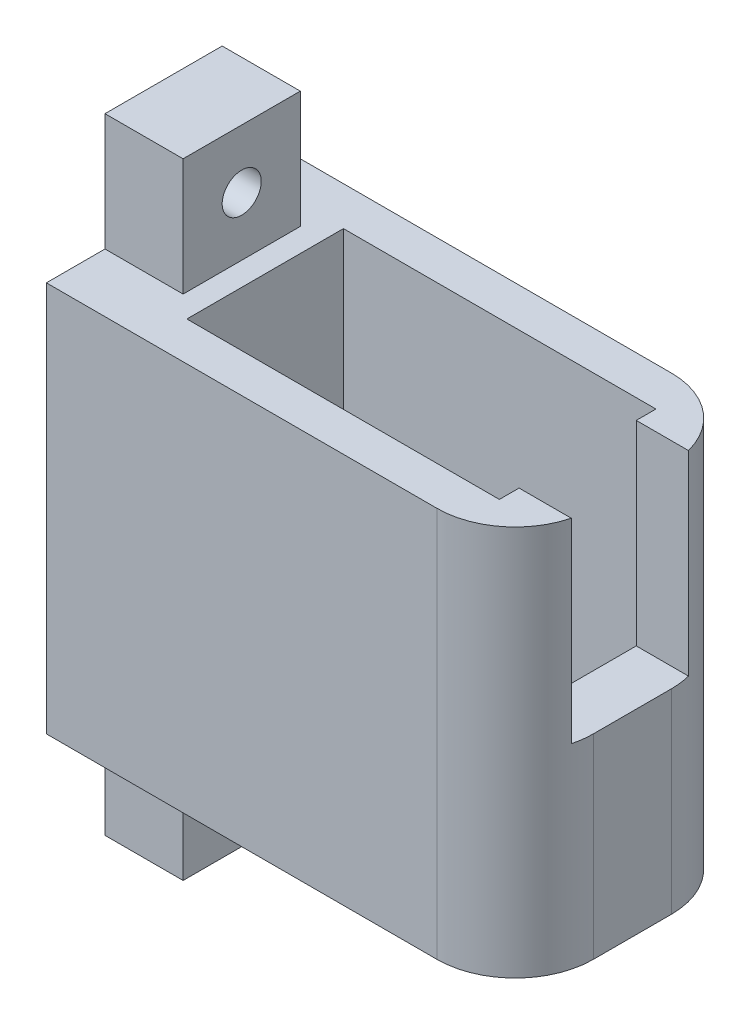
ISO-10303-21;
HEADER;
FILE_DESCRIPTION(('STEP AP214'),'2;1');
FILE_NAME('part.step','',(''),(''),'','','');
FILE_SCHEMA(('AUTOMOTIVE_DESIGN { 1 0 10303 214 1 1 1 1 }'));
ENDSEC;
DATA;
#1=APPLICATION_CONTEXT('core data for automotive mechanical design processes');
#2=APPLICATION_PROTOCOL_DEFINITION('international standard','automotive_design',2000,#1);
#3=PRODUCT_CONTEXT('',#1,'mechanical');
#4=PRODUCT('Part','Part','',(#3));
#5=PRODUCT_RELATED_PRODUCT_CATEGORY('part','',(#4));
#6=PRODUCT_DEFINITION_FORMATION('','',#4);
#7=PRODUCT_DEFINITION_CONTEXT('part definition',#1,'design');
#8=PRODUCT_DEFINITION('design','',#6,#7);
#9=PRODUCT_DEFINITION_SHAPE('','',#8);
#10=(LENGTH_UNIT() NAMED_UNIT(*) SI_UNIT(.MILLI.,.METRE.));
#11=(NAMED_UNIT(*) PLANE_ANGLE_UNIT() SI_UNIT($,.RADIAN.));
#12=(NAMED_UNIT(*) SI_UNIT($,.STERADIAN.) SOLID_ANGLE_UNIT());
#13=UNCERTAINTY_MEASURE_WITH_UNIT(LENGTH_MEASURE(1.E-05),#10,'distance_accuracy_value','');
#14=(GEOMETRIC_REPRESENTATION_CONTEXT(3) GLOBAL_UNCERTAINTY_ASSIGNED_CONTEXT((#13)) GLOBAL_UNIT_ASSIGNED_CONTEXT((#10,
#11,#12)) REPRESENTATION_CONTEXT('',''));
#15=CARTESIAN_POINT('',(0.,0.,0.));
#16=DIRECTION('',(0.,0.,1.));
#17=DIRECTION('',(1.,0.,0.));
#18=AXIS2_PLACEMENT_3D('',#15,#16,#17);
#19=CARTESIAN_POINT('',(3.,-20.,10.02));
#20=DIRECTION('',(0.,-1.,0.));
#21=DIRECTION('',(0.,0.,-1.));
#22=AXIS2_PLACEMENT_3D('',#19,#20,#21);
#23=PLANE('',#22);
#24=CARTESIAN_POINT('',(32.98,-20.,0.));
#25=DIRECTION('',(0.,1.,0.));
#26=DIRECTION('',(0.,0.,1.));
#27=AXIS2_PLACEMENT_3D('',#24,#25,#26);
#28=CIRCLE('',#27,10.02);
#29=CARTESIAN_POINT('',(32.98,-20.,10.02));
#30=VERTEX_POINT('',#29);
#31=CARTESIAN_POINT('',(43.,-20.,0.));
#32=VERTEX_POINT('',#31);
#33=EDGE_CURVE('E238',#30,#32,#28,.T.);
#34=ORIENTED_EDGE('',*,*,#33,.F.);
#35=DIRECTION('',(1.,0.,0.));
#36=VECTOR('',#35,1.);
#37=CARTESIAN_POINT('',(3.,-20.,10.02));
#38=LINE('',#37,#36);
#39=CARTESIAN_POINT('',(43.,-20.,10.02));
#40=VERTEX_POINT('',#39);
#41=EDGE_CURVE('E350',#30,#40,#38,.T.);
#42=ORIENTED_EDGE('',*,*,#41,.T.);
#43=DIRECTION('',(0.,0.,-1.));
#44=VECTOR('',#43,1.);
#45=CARTESIAN_POINT('',(43.,-20.,10.02));
#46=LINE('',#45,#44);
#47=EDGE_CURVE('E354',#40,#32,#46,.T.);
#48=ORIENTED_EDGE('',*,*,#47,.T.);
#49=EDGE_LOOP('',(#34,#42,#48));
#50=FACE_BOUND('',#49,.T.);
#51=ADVANCED_FACE('F39',(#50),#23,.F.);
#52=CARTESIAN_POINT('',(32.98,-20.,-10.02));
#53=VERTEX_POINT('',#52);
#54=EDGE_CURVE('E326',#32,#53,#28,.T.);
#55=ORIENTED_EDGE('',*,*,#54,.F.);
#56=CARTESIAN_POINT('',(43.,-20.,-10.02));
#57=VERTEX_POINT('',#56);
#58=EDGE_CURVE('E353',#32,#57,#46,.T.);
#59=ORIENTED_EDGE('',*,*,#58,.T.);
#60=DIRECTION('',(1.,0.,0.));
#61=VECTOR('',#60,1.);
#62=CARTESIAN_POINT('',(3.,-20.,-10.02));
#63=LINE('',#62,#61);
#64=EDGE_CURVE('E370',#53,#57,#63,.T.);
#65=ORIENTED_EDGE('',*,*,#64,.F.);
#66=EDGE_LOOP('',(#55,#59,#65));
#67=FACE_BOUND('',#66,.T.);
#68=ADVANCED_FACE('F422',(#67),#23,.F.);
#69=CARTESIAN_POINT('',(50.,25.,15.));
#70=DIRECTION('',(0.,-1.,0.));
#71=DIRECTION('',(0.,0.,-1.));
#72=AXIS2_PLACEMENT_3D('',#69,#70,#71);
#73=PLANE('',#72);
#74=DIRECTION('',(1.,0.,0.));
#75=VECTOR('',#74,1.);
#76=CARTESIAN_POINT('',(10.,25.,-7.5));
#77=LINE('',#76,#75);
#78=CARTESIAN_POINT('',(43.,25.,-7.5));
#79=VERTEX_POINT('',#78);
#80=CARTESIAN_POINT('',(49.6824583655185,25.,-7.5));
#81=VERTEX_POINT('',#80);
#82=EDGE_CURVE('E335',#79,#81,#77,.T.);
#83=ORIENTED_EDGE('',*,*,#82,.T.);
#84=CARTESIAN_POINT('',(40.,25.,-5.));
#85=DIRECTION('',(0.,-1.,0.));
#86=DIRECTION('',(0.,0.,-1.));
#87=AXIS2_PLACEMENT_3D('',#84,#85,#86);
#88=CIRCLE('',#87,10.);
#89=CARTESIAN_POINT('',(40.,25.,-15.));
#90=VERTEX_POINT('',#89);
#91=EDGE_CURVE('E260',#81,#90,#88,.F.);
#92=ORIENTED_EDGE('',*,*,#91,.T.);
#93=DIRECTION('',(-1.,0.,0.));
#94=VECTOR('',#93,1.);
#95=CARTESIAN_POINT('',(50.,25.,-15.));
#96=LINE('',#95,#94);
#97=CARTESIAN_POINT('',(-10.,25.,-15.));
#98=VERTEX_POINT('',#97);
#99=EDGE_CURVE('E299',#90,#98,#96,.T.);
#100=ORIENTED_EDGE('',*,*,#99,.T.);
#101=DIRECTION('',(0.,0.,-1.));
#102=VECTOR('',#101,1.);
#103=CARTESIAN_POINT('',(-10.,25.,15.));
#104=LINE('',#103,#102);
#105=CARTESIAN_POINT('',(-10.,25.,-7.5));
#106=VERTEX_POINT('',#105);
#107=EDGE_CURVE('E382',#106,#98,#104,.T.);
#108=ORIENTED_EDGE('',*,*,#107,.F.);
#109=DIRECTION('',(1.,0.,0.));
#110=VECTOR('',#109,1.);
#111=CARTESIAN_POINT('',(-40.,25.,-7.5));
#112=LINE('',#111,#110);
#113=CARTESIAN_POINT('',(0.,25.,-7.5));
#114=VERTEX_POINT('',#113);
#115=EDGE_CURVE('E706',#106,#114,#112,.T.);
#116=ORIENTED_EDGE('',*,*,#115,.T.);
#117=DIRECTION('',(0.,0.,-1.));
#118=VECTOR('',#117,1.);
#119=CARTESIAN_POINT('',(0.,25.,15.));
#120=LINE('',#119,#118);
#121=CARTESIAN_POINT('',(0.,25.,7.5));
#122=VERTEX_POINT('',#121);
#123=EDGE_CURVE('E287',#122,#114,#120,.T.);
#124=ORIENTED_EDGE('',*,*,#123,.F.);
#125=DIRECTION('',(1.,0.,0.));
#126=VECTOR('',#125,1.);
#127=CARTESIAN_POINT('',(-40.,25.,7.5));
#128=LINE('',#127,#126);
#129=CARTESIAN_POINT('',(-10.,25.,7.5));
#130=VERTEX_POINT('',#129);
#131=EDGE_CURVE('E696',#130,#122,#128,.T.);
#132=ORIENTED_EDGE('',*,*,#131,.F.);
#133=DIRECTION('',(0.,0.,-1.));
#134=VECTOR('',#133,1.);
#135=CARTESIAN_POINT('',(-10.,25.,15.));
#136=LINE('',#135,#134);
#137=CARTESIAN_POINT('',(-10.,25.,15.));
#138=VERTEX_POINT('',#137);
#139=EDGE_CURVE('E282',#138,#130,#136,.T.);
#140=ORIENTED_EDGE('',*,*,#139,.F.);
#141=DIRECTION('',(-1.,0.,0.));
#142=VECTOR('',#141,1.);
#143=CARTESIAN_POINT('',(50.,25.,15.));
#144=LINE('',#143,#142);
#145=CARTESIAN_POINT('',(40.,25.,15.));
#146=VERTEX_POINT('',#145);
#147=EDGE_CURVE('E271',#146,#138,#144,.T.);
#148=ORIENTED_EDGE('',*,*,#147,.F.);
#149=CARTESIAN_POINT('',(40.,25.,5.));
#150=DIRECTION('',(0.,-1.,0.));
#151=DIRECTION('',(0.,0.,-1.));
#152=AXIS2_PLACEMENT_3D('',#149,#150,#151);
#153=CIRCLE('',#152,10.);
#154=CARTESIAN_POINT('',(49.6824583655185,25.,7.5));
#155=VERTEX_POINT('',#154);
#156=EDGE_CURVE('E258',#146,#155,#153,.F.);
#157=ORIENTED_EDGE('',*,*,#156,.T.);
#158=DIRECTION('',(1.,0.,0.));
#159=VECTOR('',#158,1.);
#160=CARTESIAN_POINT('',(10.,25.,7.5));
#161=LINE('',#160,#159);
#162=CARTESIAN_POINT('',(43.,25.,7.5));
#163=VERTEX_POINT('',#162);
#164=EDGE_CURVE('E329',#163,#155,#161,.T.);
#165=ORIENTED_EDGE('',*,*,#164,.F.);
#166=DIRECTION('',(0.,0.,1.));
#167=VECTOR('',#166,1.);
#168=CARTESIAN_POINT('',(43.,25.,10.02));
#169=LINE('',#168,#167);
#170=CARTESIAN_POINT('',(43.,25.,10.02));
#171=VERTEX_POINT('',#170);
#172=EDGE_CURVE('E359',#163,#171,#169,.T.);
#173=ORIENTED_EDGE('',*,*,#172,.T.);
#174=DIRECTION('',(1.,0.,0.));
#175=VECTOR('',#174,1.);
#176=CARTESIAN_POINT('',(3.,25.,10.02));
#177=LINE('',#176,#175);
#178=CARTESIAN_POINT('',(3.,25.,10.02));
#179=VERTEX_POINT('',#178);
#180=EDGE_CURVE('E297',#179,#171,#177,.T.);
#181=ORIENTED_EDGE('',*,*,#180,.F.);
#182=DIRECTION('',(0.,0.,1.));
#183=VECTOR('',#182,1.);
#184=CARTESIAN_POINT('',(3.,25.,10.02));
#185=LINE('',#184,#183);
#186=CARTESIAN_POINT('',(3.,25.,-10.02));
#187=VERTEX_POINT('',#186);
#188=EDGE_CURVE('E347',#187,#179,#185,.T.);
#189=ORIENTED_EDGE('',*,*,#188,.F.);
#190=DIRECTION('',(1.,0.,0.));
#191=VECTOR('',#190,1.);
#192=CARTESIAN_POINT('',(3.,25.,-10.02));
#193=LINE('',#192,#191);
#194=CARTESIAN_POINT('',(43.,25.,-10.02));
#195=VERTEX_POINT('',#194);
#196=EDGE_CURVE('E364',#187,#195,#193,.T.);
#197=ORIENTED_EDGE('',*,*,#196,.T.);
#198=EDGE_CURVE('E341',#195,#79,#169,.T.);
#199=ORIENTED_EDGE('',*,*,#198,.T.);
#200=EDGE_LOOP('',(#83,#92,#100,#108,#116,#124,#132,#140,#148,#157,#165,#173,#181,#189,#197,#199));
#201=FACE_BOUND('',#200,.T.);
#202=ADVANCED_FACE('F277',(#201),#73,.F.);
#203=CARTESIAN_POINT('',(0.,40.,15.));
#204=DIRECTION('',(0.,-1.,0.));
#205=DIRECTION('',(1.,0.,0.));
#206=AXIS2_PLACEMENT_3D('',#203,#204,#205);
#207=PLANE('',#206);
#208=DIRECTION('',(0.,0.,-1.));
#209=VECTOR('',#208,1.);
#210=CARTESIAN_POINT('',(0.,40.,15.));
#211=LINE('',#210,#209);
#212=CARTESIAN_POINT('',(0.,40.,7.5));
#213=VERTEX_POINT('',#212);
#214=CARTESIAN_POINT('',(0.,40.,-7.5));
#215=VERTEX_POINT('',#214);
#216=EDGE_CURVE('E284',#213,#215,#211,.T.);
#217=ORIENTED_EDGE('',*,*,#216,.T.);
#218=DIRECTION('',(1.,0.,0.));
#219=VECTOR('',#218,1.);
#220=CARTESIAN_POINT('',(-40.,40.,-7.5));
#221=LINE('',#220,#219);
#222=CARTESIAN_POINT('',(-10.,40.,-7.5));
#223=VERTEX_POINT('',#222);
#224=EDGE_CURVE('E710',#223,#215,#221,.T.);
#225=ORIENTED_EDGE('',*,*,#224,.F.);
#226=DIRECTION('',(0.,0.,-1.));
#227=VECTOR('',#226,1.);
#228=CARTESIAN_POINT('',(-10.,40.,15.));
#229=LINE('',#228,#227);
#230=CARTESIAN_POINT('',(-10.,40.,7.5));
#231=VERTEX_POINT('',#230);
#232=EDGE_CURVE('E225',#231,#223,#229,.T.);
#233=ORIENTED_EDGE('',*,*,#232,.F.);
#234=DIRECTION('',(1.,0.,0.));
#235=VECTOR('',#234,1.);
#236=CARTESIAN_POINT('',(-40.,40.,7.5));
#237=LINE('',#236,#235);
#238=EDGE_CURVE('E701',#231,#213,#237,.T.);
#239=ORIENTED_EDGE('',*,*,#238,.T.);
#240=EDGE_LOOP('',(#217,#225,#233,#239));
#241=FACE_BOUND('',#240,.T.);
#242=ADVANCED_FACE('F542',(#241),#207,.F.);
#243=CARTESIAN_POINT('',(-10.,40.,15.));
#244=DIRECTION('',(1.,0.,0.));
#245=DIRECTION('',(0.,0.,-1.));
#246=AXIS2_PLACEMENT_3D('',#243,#244,#245);
#247=PLANE('',#246);
#248=CARTESIAN_POINT('',(-10.,-32.5,0.));
#249=DIRECTION('',(1.,0.,0.));
#250=DIRECTION('',(0.,0.,-1.));
#251=AXIS2_PLACEMENT_3D('',#248,#249,#250);
#252=CIRCLE('',#251,2.5);
#253=CARTESIAN_POINT('',(-10.,-32.5,-2.5));
#254=VERTEX_POINT('',#253);
#255=EDGE_CURVE('E399',#254,#254,#252,.T.);
#256=ORIENTED_EDGE('',*,*,#255,.T.);
#257=EDGE_LOOP('',(#256));
#258=FACE_BOUND('',#257,.T.);
#259=CARTESIAN_POINT('',(-10.,32.5,0.));
#260=DIRECTION('',(1.,0.,0.));
#261=DIRECTION('',(0.,0.,-1.));
#262=AXIS2_PLACEMENT_3D('',#259,#260,#261);
#263=CIRCLE('',#262,2.5);
#264=CARTESIAN_POINT('',(-10.,32.5,-2.5));
#265=VERTEX_POINT('',#264);
#266=EDGE_CURVE('E384',#265,#265,#263,.T.);
#267=ORIENTED_EDGE('',*,*,#266,.T.);
#268=EDGE_LOOP('',(#267));
#269=FACE_BOUND('',#268,.T.);
#270=DIRECTION('',(0.,-1.,0.));
#271=VECTOR('',#270,1.);
#272=CARTESIAN_POINT('',(-10.,40.,-7.5));
#273=LINE('',#272,#271);
#274=EDGE_CURVE('E395',#223,#106,#273,.T.);
#275=ORIENTED_EDGE('',*,*,#274,.T.);
#276=ORIENTED_EDGE('',*,*,#107,.T.);
#277=DIRECTION('',(0.,-1.,0.));
#278=VECTOR('',#277,1.);
#279=CARTESIAN_POINT('',(-10.,40.,-15.));
#280=LINE('',#279,#278);
#281=CARTESIAN_POINT('',(-10.,-25.,-15.));
#282=VERTEX_POINT('',#281);
#283=EDGE_CURVE('E293',#98,#282,#280,.T.);
#284=ORIENTED_EDGE('',*,*,#283,.T.);
#285=DIRECTION('',(0.,0.,1.));
#286=VECTOR('',#285,1.);
#287=CARTESIAN_POINT('',(-10.,-25.,15.));
#288=LINE('',#287,#286);
#289=CARTESIAN_POINT('',(-10.,-25.,-7.5));
#290=VERTEX_POINT('',#289);
#291=EDGE_CURVE('E387',#282,#290,#288,.T.);
#292=ORIENTED_EDGE('',*,*,#291,.T.);
#293=DIRECTION('',(0.,-1.,0.));
#294=VECTOR('',#293,1.);
#295=CARTESIAN_POINT('',(-10.,40.,-7.5));
#296=LINE('',#295,#294);
#297=CARTESIAN_POINT('',(-10.,-40.,-7.5));
#298=VERTEX_POINT('',#297);
#299=EDGE_CURVE('E397',#290,#298,#296,.T.);
#300=ORIENTED_EDGE('',*,*,#299,.T.);
#301=DIRECTION('',(0.,0.,-1.));
#302=VECTOR('',#301,1.);
#303=CARTESIAN_POINT('',(-10.,-40.,15.));
#304=LINE('',#303,#302);
#305=CARTESIAN_POINT('',(-10.,-40.,7.5));
#306=VERTEX_POINT('',#305);
#307=EDGE_CURVE('E217',#306,#298,#304,.T.);
#308=ORIENTED_EDGE('',*,*,#307,.F.);
#309=DIRECTION('',(0.,1.,0.));
#310=VECTOR('',#309,1.);
#311=CARTESIAN_POINT('',(-10.,40.,7.5));
#312=LINE('',#311,#310);
#313=CARTESIAN_POINT('',(-10.,-25.,7.5));
#314=VERTEX_POINT('',#313);
#315=EDGE_CURVE('E380',#306,#314,#312,.T.);
#316=ORIENTED_EDGE('',*,*,#315,.T.);
#317=DIRECTION('',(0.,0.,1.));
#318=VECTOR('',#317,1.);
#319=CARTESIAN_POINT('',(-10.,-25.,15.));
#320=LINE('',#319,#318);
#321=CARTESIAN_POINT('',(-10.,-25.,15.));
#322=VERTEX_POINT('',#321);
#323=EDGE_CURVE('E379',#314,#322,#320,.T.);
#324=ORIENTED_EDGE('',*,*,#323,.T.);
#325=DIRECTION('',(0.,-1.,0.));
#326=VECTOR('',#325,1.);
#327=CARTESIAN_POINT('',(-10.,40.,15.));
#328=LINE('',#327,#326);
#329=EDGE_CURVE('E289',#138,#322,#328,.T.);
#330=ORIENTED_EDGE('',*,*,#329,.F.);
#331=ORIENTED_EDGE('',*,*,#139,.T.);
#332=DIRECTION('',(0.,1.,0.));
#333=VECTOR('',#332,1.);
#334=CARTESIAN_POINT('',(-10.,40.,7.5));
#335=LINE('',#334,#333);
#336=EDGE_CURVE('E393',#130,#231,#335,.T.);
#337=ORIENTED_EDGE('',*,*,#336,.T.);
#338=ORIENTED_EDGE('',*,*,#232,.T.);
#339=EDGE_LOOP('',(#275,#276,#284,#292,#300,#308,#316,#324,#330,#331,#337,#338));
#340=FACE_BOUND('',#339,.T.);
#341=ADVANCED_FACE('F376',(#258,#269,#340),#247,.F.);
#342=CARTESIAN_POINT('',(-10.,-40.,15.));
#343=DIRECTION('',(0.,1.,0.));
#344=DIRECTION('',(-1.,0.,0.));
#345=AXIS2_PLACEMENT_3D('',#342,#343,#344);
#346=PLANE('',#345);
#347=DIRECTION('',(0.,0.,-1.));
#348=VECTOR('',#347,1.);
#349=CARTESIAN_POINT('',(0.,-40.,15.));
#350=LINE('',#349,#348);
#351=CARTESIAN_POINT('',(0.,-40.,7.5));
#352=VERTEX_POINT('',#351);
#353=CARTESIAN_POINT('',(0.,-40.,-7.5));
#354=VERTEX_POINT('',#353);
#355=EDGE_CURVE('E215',#352,#354,#350,.T.);
#356=ORIENTED_EDGE('',*,*,#355,.F.);
#357=DIRECTION('',(1.,0.,0.));
#358=VECTOR('',#357,1.);
#359=CARTESIAN_POINT('',(-40.,-40.,7.5));
#360=LINE('',#359,#358);
#361=EDGE_CURVE('E721',#306,#352,#360,.T.);
#362=ORIENTED_EDGE('',*,*,#361,.F.);
#363=ORIENTED_EDGE('',*,*,#307,.T.);
#364=DIRECTION('',(1.,0.,0.));
#365=VECTOR('',#364,1.);
#366=CARTESIAN_POINT('',(-40.,-40.,-7.5));
#367=LINE('',#366,#365);
#368=EDGE_CURVE('E200',#298,#354,#367,.T.);
#369=ORIENTED_EDGE('',*,*,#368,.T.);
#370=EDGE_LOOP('',(#356,#362,#363,#369));
#371=FACE_BOUND('',#370,.T.);
#372=ADVANCED_FACE('F213',(#371),#346,.F.);
#373=CARTESIAN_POINT('',(0.,-40.,15.));
#374=DIRECTION('',(-1.,0.,0.));
#375=DIRECTION('',(0.,0.,1.));
#376=AXIS2_PLACEMENT_3D('',#373,#374,#375);
#377=PLANE('',#376);
#378=CARTESIAN_POINT('',(0.,-32.5,0.));
#379=DIRECTION('',(1.,0.,0.));
#380=DIRECTION('',(0.,0.,-1.));
#381=AXIS2_PLACEMENT_3D('',#378,#379,#380);
#382=CIRCLE('',#381,2.5);
#383=CARTESIAN_POINT('',(0.,-32.5,-2.5));
#384=VERTEX_POINT('',#383);
#385=EDGE_CURVE('E714',#384,#384,#382,.T.);
#386=ORIENTED_EDGE('',*,*,#385,.F.);
#387=EDGE_LOOP('',(#386));
#388=FACE_BOUND('',#387,.T.);
#389=DIRECTION('',(0.,0.,-1.));
#390=VECTOR('',#389,1.);
#391=CARTESIAN_POINT('',(0.,-25.,15.));
#392=LINE('',#391,#390);
#393=CARTESIAN_POINT('',(0.,-25.,7.5));
#394=VERTEX_POINT('',#393);
#395=CARTESIAN_POINT('',(0.,-25.,-7.5));
#396=VERTEX_POINT('',#395);
#397=EDGE_CURVE('E223',#394,#396,#392,.T.);
#398=ORIENTED_EDGE('',*,*,#397,.F.);
#399=DIRECTION('',(0.,1.,0.));
#400=VECTOR('',#399,1.);
#401=CARTESIAN_POINT('',(0.,-40.,7.5));
#402=LINE('',#401,#400);
#403=EDGE_CURVE('E222',#352,#394,#402,.T.);
#404=ORIENTED_EDGE('',*,*,#403,.F.);
#405=ORIENTED_EDGE('',*,*,#355,.T.);
#406=DIRECTION('',(0.,-1.,0.));
#407=VECTOR('',#406,1.);
#408=CARTESIAN_POINT('',(0.,-40.,-7.5));
#409=LINE('',#408,#407);
#410=EDGE_CURVE('E197',#396,#354,#409,.T.);
#411=ORIENTED_EDGE('',*,*,#410,.F.);
#412=EDGE_LOOP('',(#398,#404,#405,#411));
#413=FACE_BOUND('',#412,.T.);
#414=ADVANCED_FACE('F220',(#388,#413),#377,.F.);
#415=CARTESIAN_POINT('',(0.,-25.,15.));
#416=DIRECTION('',(0.,1.,0.));
#417=DIRECTION('',(0.,0.,1.));
#418=AXIS2_PLACEMENT_3D('',#415,#416,#417);
#419=PLANE('',#418);
#420=CARTESIAN_POINT('',(32.98,-25.,0.));
#421=DIRECTION('',(0.,1.,0.));
#422=DIRECTION('',(0.,0.,1.));
#423=AXIS2_PLACEMENT_3D('',#420,#421,#422);
#424=CIRCLE('',#423,10.02);
#425=CARTESIAN_POINT('',(32.98,-25.,10.02));
#426=VERTEX_POINT('',#425);
#427=EDGE_CURVE('E234',#426,#426,#424,.T.);
#428=ORIENTED_EDGE('',*,*,#427,.T.);
#429=EDGE_LOOP('',(#428));
#430=FACE_BOUND('',#429,.T.);
#431=DIRECTION('',(1.,0.,0.));
#432=VECTOR('',#431,1.);
#433=CARTESIAN_POINT('',(0.,-25.,-15.));
#434=LINE('',#433,#432);
#435=CARTESIAN_POINT('',(40.,-25.,-15.));
#436=VERTEX_POINT('',#435);
#437=EDGE_CURVE('E296',#282,#436,#434,.T.);
#438=ORIENTED_EDGE('',*,*,#437,.T.);
#439=CARTESIAN_POINT('',(40.,-25.,-5.));
#440=DIRECTION('',(0.,1.,0.));
#441=DIRECTION('',(0.,0.,1.));
#442=AXIS2_PLACEMENT_3D('',#439,#440,#441);
#443=CIRCLE('',#442,10.);
#444=CARTESIAN_POINT('',(50.,-25.,-5.));
#445=VERTEX_POINT('',#444);
#446=EDGE_CURVE('E264',#436,#445,#443,.F.);
#447=ORIENTED_EDGE('',*,*,#446,.T.);
#448=DIRECTION('',(0.,0.,-1.));
#449=VECTOR('',#448,1.);
#450=CARTESIAN_POINT('',(50.,-25.,15.));
#451=LINE('',#450,#449);
#452=CARTESIAN_POINT('',(50.,-25.,5.));
#453=VERTEX_POINT('',#452);
#454=EDGE_CURVE('E227',#453,#445,#451,.T.);
#455=ORIENTED_EDGE('',*,*,#454,.F.);
#456=CARTESIAN_POINT('',(40.,-25.,5.));
#457=DIRECTION('',(0.,1.,0.));
#458=DIRECTION('',(0.,0.,1.));
#459=AXIS2_PLACEMENT_3D('',#456,#457,#458);
#460=CIRCLE('',#459,10.);
#461=CARTESIAN_POINT('',(40.,-25.,15.));
#462=VERTEX_POINT('',#461);
#463=EDGE_CURVE('E54',#453,#462,#460,.F.);
#464=ORIENTED_EDGE('',*,*,#463,.T.);
#465=DIRECTION('',(1.,0.,0.));
#466=VECTOR('',#465,1.);
#467=CARTESIAN_POINT('',(0.,-25.,15.));
#468=LINE('',#467,#466);
#469=EDGE_CURVE('E273',#322,#462,#468,.T.);
#470=ORIENTED_EDGE('',*,*,#469,.F.);
#471=ORIENTED_EDGE('',*,*,#323,.F.);
#472=DIRECTION('',(1.,0.,0.));
#473=VECTOR('',#472,1.);
#474=CARTESIAN_POINT('',(-40.,-25.,7.5));
#475=LINE('',#474,#473);
#476=EDGE_CURVE('E208',#314,#394,#475,.T.);
#477=ORIENTED_EDGE('',*,*,#476,.T.);
#478=ORIENTED_EDGE('',*,*,#397,.T.);
#479=DIRECTION('',(1.,0.,0.));
#480=VECTOR('',#479,1.);
#481=CARTESIAN_POINT('',(-40.,-25.,-7.5));
#482=LINE('',#481,#480);
#483=EDGE_CURVE('E203',#290,#396,#482,.T.);
#484=ORIENTED_EDGE('',*,*,#483,.F.);
#485=ORIENTED_EDGE('',*,*,#291,.F.);
#486=EDGE_LOOP('',(#438,#447,#455,#464,#470,#471,#477,#478,#484,#485));
#487=FACE_BOUND('',#486,.T.);
#488=ADVANCED_FACE('F526',(#430,#487),#419,.F.);
#489=CARTESIAN_POINT('',(50.,-25.,15.));
#490=DIRECTION('',(-1.,0.,0.));
#491=DIRECTION('',(0.,0.,1.));
#492=AXIS2_PLACEMENT_3D('',#489,#490,#491);
#493=PLANE('',#492);
#494=ORIENTED_EDGE('',*,*,#454,.T.);
#495=DIRECTION('',(0.,1.,0.));
#496=VECTOR('',#495,1.);
#497=CARTESIAN_POINT('',(50.,-25.,-5.));
#498=LINE('',#497,#496);
#499=CARTESIAN_POINT('',(50.,0.,-5.));
#500=VERTEX_POINT('',#499);
#501=EDGE_CURVE('E249',#445,#500,#498,.T.);
#502=ORIENTED_EDGE('',*,*,#501,.T.);
#503=DIRECTION('',(0.,0.,-1.));
#504=VECTOR('',#503,1.);
#505=CARTESIAN_POINT('',(50.,0.,7.5));
#506=LINE('',#505,#504);
#507=CARTESIAN_POINT('',(50.,0.,5.));
#508=VERTEX_POINT('',#507);
#509=EDGE_CURVE('E320',#508,#500,#506,.T.);
#510=ORIENTED_EDGE('',*,*,#509,.F.);
#511=DIRECTION('',(0.,1.,0.));
#512=VECTOR('',#511,1.);
#513=CARTESIAN_POINT('',(50.,-25.,5.));
#514=LINE('',#513,#512);
#515=EDGE_CURVE('E247',#508,#453,#514,.F.);
#516=ORIENTED_EDGE('',*,*,#515,.T.);
#517=EDGE_LOOP('',(#494,#502,#510,#516));
#518=FACE_BOUND('',#517,.T.);
#519=ADVANCED_FACE('F305',(#518),#493,.F.);
#520=CARTESIAN_POINT('',(0.,25.,15.));
#521=DIRECTION('',(-1.,0.,0.));
#522=DIRECTION('',(0.,0.,1.));
#523=AXIS2_PLACEMENT_3D('',#520,#521,#522);
#524=PLANE('',#523);
#525=CARTESIAN_POINT('',(0.,32.5,0.));
#526=DIRECTION('',(1.,0.,0.));
#527=DIRECTION('',(0.,0.,-1.));
#528=AXIS2_PLACEMENT_3D('',#525,#526,#527);
#529=CIRCLE('',#528,2.5);
#530=CARTESIAN_POINT('',(0.,32.5,-2.5));
#531=VERTEX_POINT('',#530);
#532=EDGE_CURVE('E716',#531,#531,#529,.T.);
#533=ORIENTED_EDGE('',*,*,#532,.F.);
#534=EDGE_LOOP('',(#533));
#535=FACE_BOUND('',#534,.T.);
#536=ORIENTED_EDGE('',*,*,#123,.T.);
#537=DIRECTION('',(0.,-1.,0.));
#538=VECTOR('',#537,1.);
#539=CARTESIAN_POINT('',(0.,40.,-7.5));
#540=LINE('',#539,#538);
#541=EDGE_CURVE('E712',#215,#114,#540,.T.);
#542=ORIENTED_EDGE('',*,*,#541,.F.);
#543=ORIENTED_EDGE('',*,*,#216,.F.);
#544=DIRECTION('',(0.,1.,0.));
#545=VECTOR('',#544,1.);
#546=CARTESIAN_POINT('',(0.,40.,7.5));
#547=LINE('',#546,#545);
#548=EDGE_CURVE('E698',#122,#213,#547,.T.);
#549=ORIENTED_EDGE('',*,*,#548,.F.);
#550=EDGE_LOOP('',(#536,#542,#543,#549));
#551=FACE_BOUND('',#550,.T.);
#552=ADVANCED_FACE('F517',(#535,#551),#524,.F.);
#553=CARTESIAN_POINT('',(0.,0.,15.));
#554=DIRECTION('',(0.,0.,1.));
#555=DIRECTION('',(1.,0.,0.));
#556=AXIS2_PLACEMENT_3D('',#553,#554,#555);
#557=PLANE('',#556);
#558=ORIENTED_EDGE('',*,*,#469,.T.);
#559=DIRECTION('',(0.,1.,0.));
#560=VECTOR('',#559,1.);
#561=CARTESIAN_POINT('',(40.,25.,15.));
#562=LINE('',#561,#560);
#563=EDGE_CURVE('E47',#462,#146,#562,.T.);
#564=ORIENTED_EDGE('',*,*,#563,.T.);
#565=ORIENTED_EDGE('',*,*,#147,.T.);
#566=ORIENTED_EDGE('',*,*,#329,.T.);
#567=EDGE_LOOP('',(#558,#564,#565,#566));
#568=FACE_BOUND('',#567,.T.);
#569=ADVANCED_FACE('F269',(#568),#557,.T.);
#570=CARTESIAN_POINT('',(0.,0.,-15.));
#571=DIRECTION('',(0.,0.,1.));
#572=DIRECTION('',(1.,0.,0.));
#573=AXIS2_PLACEMENT_3D('',#570,#571,#572);
#574=PLANE('',#573);
#575=ORIENTED_EDGE('',*,*,#99,.F.);
#576=DIRECTION('',(0.,1.,0.));
#577=VECTOR('',#576,1.);
#578=CARTESIAN_POINT('',(40.,0.,-15.));
#579=LINE('',#578,#577);
#580=EDGE_CURVE('E62',#90,#436,#579,.F.);
#581=ORIENTED_EDGE('',*,*,#580,.T.);
#582=ORIENTED_EDGE('',*,*,#437,.F.);
#583=ORIENTED_EDGE('',*,*,#283,.F.);
#584=EDGE_LOOP('',(#575,#581,#582,#583));
#585=FACE_BOUND('',#584,.T.);
#586=ADVANCED_FACE('F505',(#585),#574,.F.);
#587=CARTESIAN_POINT('',(3.,25.,10.02));
#588=DIRECTION('',(0.,0.,1.));
#589=DIRECTION('',(0.,-1.,0.));
#590=AXIS2_PLACEMENT_3D('',#587,#588,#589);
#591=PLANE('',#590);
#592=DIRECTION('',(0.,-1.,0.));
#593=VECTOR('',#592,1.);
#594=CARTESIAN_POINT('',(43.,25.,10.02));
#595=LINE('',#594,#593);
#596=EDGE_CURVE('E237',#171,#40,#595,.T.);
#597=ORIENTED_EDGE('',*,*,#596,.T.);
#598=ORIENTED_EDGE('',*,*,#41,.F.);
#599=CARTESIAN_POINT('',(3.,-20.,10.02));
#600=VERTEX_POINT('',#599);
#601=EDGE_CURVE('E371',#600,#30,#38,.T.);
#602=ORIENTED_EDGE('',*,*,#601,.F.);
#603=DIRECTION('',(0.,-1.,0.));
#604=VECTOR('',#603,1.);
#605=CARTESIAN_POINT('',(3.,25.,10.02));
#606=LINE('',#605,#604);
#607=EDGE_CURVE('E337',#179,#600,#606,.T.);
#608=ORIENTED_EDGE('',*,*,#607,.F.);
#609=ORIENTED_EDGE('',*,*,#180,.T.);
#610=EDGE_LOOP('',(#597,#598,#602,#608,#609));
#611=FACE_BOUND('',#610,.T.);
#612=ADVANCED_FACE('F445',(#611),#591,.F.);
#613=CARTESIAN_POINT('',(3.,25.,-10.02));
#614=DIRECTION('',(0.,0.,-1.));
#615=DIRECTION('',(0.,1.,0.));
#616=AXIS2_PLACEMENT_3D('',#613,#614,#615);
#617=PLANE('',#616);
#618=DIRECTION('',(0.,1.,0.));
#619=VECTOR('',#618,1.);
#620=CARTESIAN_POINT('',(43.,25.,-10.02));
#621=LINE('',#620,#619);
#622=EDGE_CURVE('E357',#57,#195,#621,.T.);
#623=ORIENTED_EDGE('',*,*,#622,.T.);
#624=ORIENTED_EDGE('',*,*,#196,.F.);
#625=DIRECTION('',(0.,1.,0.));
#626=VECTOR('',#625,1.);
#627=CARTESIAN_POINT('',(3.,25.,-10.02));
#628=LINE('',#627,#626);
#629=CARTESIAN_POINT('',(3.,-20.,-10.02));
#630=VERTEX_POINT('',#629);
#631=EDGE_CURVE('E344',#630,#187,#628,.T.);
#632=ORIENTED_EDGE('',*,*,#631,.F.);
#633=EDGE_CURVE('E367',#630,#53,#63,.T.);
#634=ORIENTED_EDGE('',*,*,#633,.T.);
#635=ORIENTED_EDGE('',*,*,#64,.T.);
#636=EDGE_LOOP('',(#623,#624,#632,#634,#635));
#637=FACE_BOUND('',#636,.T.);
#638=ADVANCED_FACE('F436',(#637),#617,.F.);
#639=EDGE_CURVE('E323',#53,#30,#28,.T.);
#640=ORIENTED_EDGE('',*,*,#639,.F.);
#641=ORIENTED_EDGE('',*,*,#633,.F.);
#642=DIRECTION('',(0.,0.,-1.));
#643=VECTOR('',#642,1.);
#644=CARTESIAN_POINT('',(3.,-20.,10.02));
#645=LINE('',#644,#643);
#646=EDGE_CURVE('E340',#600,#630,#645,.T.);
#647=ORIENTED_EDGE('',*,*,#646,.F.);
#648=ORIENTED_EDGE('',*,*,#601,.T.);
#649=EDGE_LOOP('',(#640,#641,#647,#648));
#650=FACE_BOUND('',#649,.T.);
#651=ADVANCED_FACE('F425',(#650),#23,.F.);
#652=CARTESIAN_POINT('',(3.,0.,0.));
#653=DIRECTION('',(1.,0.,0.));
#654=DIRECTION('',(0.,0.,-1.));
#655=AXIS2_PLACEMENT_3D('',#652,#653,#654);
#656=PLANE('',#655);
#657=ORIENTED_EDGE('',*,*,#607,.T.);
#658=ORIENTED_EDGE('',*,*,#646,.T.);
#659=ORIENTED_EDGE('',*,*,#631,.T.);
#660=ORIENTED_EDGE('',*,*,#188,.T.);
#661=EDGE_LOOP('',(#657,#658,#659,#660));
#662=FACE_BOUND('',#661,.T.);
#663=ADVANCED_FACE('F435',(#662),#656,.T.);
#664=CARTESIAN_POINT('',(43.,0.,0.));
#665=DIRECTION('',(1.,0.,0.));
#666=DIRECTION('',(0.,0.,-1.));
#667=AXIS2_PLACEMENT_3D('',#664,#665,#666);
#668=PLANE('',#667);
#669=DIRECTION('',(0.,0.,-1.));
#670=VECTOR('',#669,1.);
#671=CARTESIAN_POINT('',(43.,0.,0.));
#672=LINE('',#671,#670);
#673=CARTESIAN_POINT('',(43.,0.,7.5));
#674=VERTEX_POINT('',#673);
#675=CARTESIAN_POINT('',(43.,0.,-7.5));
#676=VERTEX_POINT('',#675);
#677=EDGE_CURVE('E241',#674,#676,#672,.T.);
#678=ORIENTED_EDGE('',*,*,#677,.T.);
#679=DIRECTION('',(0.,1.,0.));
#680=VECTOR('',#679,1.);
#681=CARTESIAN_POINT('',(43.,0.,-7.5));
#682=LINE('',#681,#680);
#683=EDGE_CURVE('E244',#676,#79,#682,.T.);
#684=ORIENTED_EDGE('',*,*,#683,.T.);
#685=ORIENTED_EDGE('',*,*,#198,.F.);
#686=ORIENTED_EDGE('',*,*,#622,.F.);
#687=ORIENTED_EDGE('',*,*,#58,.F.);
#688=ORIENTED_EDGE('',*,*,#47,.F.);
#689=ORIENTED_EDGE('',*,*,#596,.F.);
#690=ORIENTED_EDGE('',*,*,#172,.F.);
#691=DIRECTION('',(0.,-1.,0.));
#692=VECTOR('',#691,1.);
#693=CARTESIAN_POINT('',(43.,0.,7.5));
#694=LINE('',#693,#692);
#695=EDGE_CURVE('E233',#163,#674,#694,.T.);
#696=ORIENTED_EDGE('',*,*,#695,.T.);
#697=EDGE_LOOP('',(#678,#684,#685,#686,#687,#688,#689,#690,#696));
#698=FACE_BOUND('',#697,.T.);
#699=ADVANCED_FACE('F442',(#698),#668,.F.);
#700=CARTESIAN_POINT('',(32.98,-60.,0.));
#701=DIRECTION('',(0.,1.,0.));
#702=DIRECTION('',(0.,0.,1.));
#703=AXIS2_PLACEMENT_3D('',#700,#701,#702);
#704=CYLINDRICAL_SURFACE('',#703,10.02);
#705=ORIENTED_EDGE('',*,*,#33,.T.);
#706=ORIENTED_EDGE('',*,*,#54,.T.);
#707=ORIENTED_EDGE('',*,*,#639,.T.);
#708=EDGE_LOOP('',(#705,#706,#707));
#709=FACE_BOUND('',#708,.T.);
#710=ORIENTED_EDGE('',*,*,#427,.F.);
#711=EDGE_LOOP('',(#710));
#712=FACE_BOUND('',#711,.T.);
#713=ADVANCED_FACE('F499',(#709,#712),#704,.F.);
#714=CARTESIAN_POINT('',(10.,0.,-7.5));
#715=DIRECTION('',(0.,0.,-1.));
#716=DIRECTION('',(-1.,0.,0.));
#717=AXIS2_PLACEMENT_3D('',#714,#715,#716);
#718=PLANE('',#717);
#719=DIRECTION('',(1.,0.,0.));
#720=VECTOR('',#719,1.);
#721=CARTESIAN_POINT('',(10.,0.,-7.5));
#722=LINE('',#721,#720);
#723=CARTESIAN_POINT('',(49.6824583655185,0.,-7.5));
#724=VERTEX_POINT('',#723);
#725=EDGE_CURVE('E319',#676,#724,#722,.T.);
#726=ORIENTED_EDGE('',*,*,#725,.T.);
#727=DIRECTION('',(0.,1.,0.));
#728=VECTOR('',#727,1.);
#729=CARTESIAN_POINT('',(49.6824583655185,0.,-7.5));
#730=LINE('',#729,#728);
#731=EDGE_CURVE('E256',#724,#81,#730,.T.);
#732=ORIENTED_EDGE('',*,*,#731,.T.);
#733=ORIENTED_EDGE('',*,*,#82,.F.);
#734=ORIENTED_EDGE('',*,*,#683,.F.);
#735=EDGE_LOOP('',(#726,#732,#733,#734));
#736=FACE_BOUND('',#735,.T.);
#737=ADVANCED_FACE('F322',(#736),#718,.F.);
#738=CARTESIAN_POINT('',(10.,0.,7.5));
#739=DIRECTION('',(0.,-1.,0.));
#740=DIRECTION('',(0.,0.,-1.));
#741=AXIS2_PLACEMENT_3D('',#738,#739,#740);
#742=PLANE('',#741);
#743=ORIENTED_EDGE('',*,*,#509,.T.);
#744=CARTESIAN_POINT('',(40.,0.,-5.));
#745=DIRECTION('',(0.,-1.,0.));
#746=DIRECTION('',(0.,0.,-1.));
#747=AXIS2_PLACEMENT_3D('',#744,#745,#746);
#748=CIRCLE('',#747,10.);
#749=EDGE_CURVE('E254',#500,#724,#748,.F.);
#750=ORIENTED_EDGE('',*,*,#749,.T.);
#751=ORIENTED_EDGE('',*,*,#725,.F.);
#752=ORIENTED_EDGE('',*,*,#677,.F.);
#753=DIRECTION('',(1.,0.,0.));
#754=VECTOR('',#753,1.);
#755=CARTESIAN_POINT('',(10.,0.,7.5));
#756=LINE('',#755,#754);
#757=CARTESIAN_POINT('',(49.6824583655185,0.,7.5));
#758=VERTEX_POINT('',#757);
#759=EDGE_CURVE('E324',#674,#758,#756,.T.);
#760=ORIENTED_EDGE('',*,*,#759,.T.);
#761=CARTESIAN_POINT('',(40.,0.,5.));
#762=DIRECTION('',(0.,-1.,0.));
#763=DIRECTION('',(0.,0.,-1.));
#764=AXIS2_PLACEMENT_3D('',#761,#762,#763);
#765=CIRCLE('',#764,10.);
#766=EDGE_CURVE('E252',#758,#508,#765,.F.);
#767=ORIENTED_EDGE('',*,*,#766,.T.);
#768=EDGE_LOOP('',(#743,#750,#751,#752,#760,#767));
#769=FACE_BOUND('',#768,.T.);
#770=ADVANCED_FACE('F317',(#769),#742,.F.);
#771=CARTESIAN_POINT('',(10.,0.,7.5));
#772=DIRECTION('',(0.,0.,1.));
#773=DIRECTION('',(1.,0.,0.));
#774=AXIS2_PLACEMENT_3D('',#771,#772,#773);
#775=PLANE('',#774);
#776=ORIENTED_EDGE('',*,*,#164,.T.);
#777=DIRECTION('',(0.,-1.,0.));
#778=VECTOR('',#777,1.);
#779=CARTESIAN_POINT('',(49.6824583655185,25.,7.5));
#780=LINE('',#779,#778);
#781=EDGE_CURVE('E11',#155,#758,#780,.T.);
#782=ORIENTED_EDGE('',*,*,#781,.T.);
#783=ORIENTED_EDGE('',*,*,#759,.F.);
#784=ORIENTED_EDGE('',*,*,#695,.F.);
#785=EDGE_LOOP('',(#776,#782,#783,#784));
#786=FACE_BOUND('',#785,.T.);
#787=ADVANCED_FACE('F466',(#786),#775,.F.);
#788=CARTESIAN_POINT('',(-40.,-40.,-7.5));
#789=DIRECTION('',(0.,0.,1.));
#790=DIRECTION('',(1.,0.,0.));
#791=AXIS2_PLACEMENT_3D('',#788,#789,#790);
#792=PLANE('',#791);
#793=ORIENTED_EDGE('',*,*,#483,.T.);
#794=ORIENTED_EDGE('',*,*,#410,.T.);
#795=ORIENTED_EDGE('',*,*,#368,.F.);
#796=ORIENTED_EDGE('',*,*,#299,.F.);
#797=EDGE_LOOP('',(#793,#794,#795,#796));
#798=FACE_BOUND('',#797,.T.);
#799=ADVANCED_FACE('F199',(#798),#792,.F.);
#800=CARTESIAN_POINT('',(-40.,40.,-7.5));
#801=DIRECTION('',(0.,0.,1.));
#802=DIRECTION('',(1.,0.,0.));
#803=AXIS2_PLACEMENT_3D('',#800,#801,#802);
#804=PLANE('',#803);
#805=ORIENTED_EDGE('',*,*,#224,.T.);
#806=ORIENTED_EDGE('',*,*,#541,.T.);
#807=ORIENTED_EDGE('',*,*,#115,.F.);
#808=ORIENTED_EDGE('',*,*,#274,.F.);
#809=EDGE_LOOP('',(#805,#806,#807,#808));
#810=FACE_BOUND('',#809,.T.);
#811=ADVANCED_FACE('F650',(#810),#804,.F.);
#812=CARTESIAN_POINT('',(-40.,-40.,7.5));
#813=DIRECTION('',(0.,0.,-1.));
#814=DIRECTION('',(-1.,0.,0.));
#815=AXIS2_PLACEMENT_3D('',#812,#813,#814);
#816=PLANE('',#815);
#817=ORIENTED_EDGE('',*,*,#361,.T.);
#818=ORIENTED_EDGE('',*,*,#403,.T.);
#819=ORIENTED_EDGE('',*,*,#476,.F.);
#820=ORIENTED_EDGE('',*,*,#315,.F.);
#821=EDGE_LOOP('',(#817,#818,#819,#820));
#822=FACE_BOUND('',#821,.T.);
#823=ADVANCED_FACE('F657',(#822),#816,.F.);
#824=CARTESIAN_POINT('',(-40.,40.,7.5));
#825=DIRECTION('',(0.,0.,-1.));
#826=DIRECTION('',(-1.,0.,0.));
#827=AXIS2_PLACEMENT_3D('',#824,#825,#826);
#828=PLANE('',#827);
#829=ORIENTED_EDGE('',*,*,#131,.T.);
#830=ORIENTED_EDGE('',*,*,#548,.T.);
#831=ORIENTED_EDGE('',*,*,#238,.F.);
#832=ORIENTED_EDGE('',*,*,#336,.F.);
#833=EDGE_LOOP('',(#829,#830,#831,#832));
#834=FACE_BOUND('',#833,.T.);
#835=ADVANCED_FACE('F415',(#834),#828,.F.);
#836=CARTESIAN_POINT('',(-40.,32.5,0.));
#837=DIRECTION('',(1.,0.,0.));
#838=DIRECTION('',(0.,0.,-1.));
#839=AXIS2_PLACEMENT_3D('',#836,#837,#838);
#840=CYLINDRICAL_SURFACE('',#839,2.5);
#841=ORIENTED_EDGE('',*,*,#532,.T.);
#842=EDGE_LOOP('',(#841));
#843=FACE_BOUND('',#842,.T.);
#844=ORIENTED_EDGE('',*,*,#266,.F.);
#845=EDGE_LOOP('',(#844));
#846=FACE_BOUND('',#845,.T.);
#847=ADVANCED_FACE('F407',(#843,#846),#840,.F.);
#848=CARTESIAN_POINT('',(-40.,-32.5,0.));
#849=DIRECTION('',(1.,0.,0.));
#850=DIRECTION('',(0.,0.,-1.));
#851=AXIS2_PLACEMENT_3D('',#848,#849,#850);
#852=CYLINDRICAL_SURFACE('',#851,2.5);
#853=ORIENTED_EDGE('',*,*,#385,.T.);
#854=EDGE_LOOP('',(#853));
#855=FACE_BOUND('',#854,.T.);
#856=ORIENTED_EDGE('',*,*,#255,.F.);
#857=EDGE_LOOP('',(#856));
#858=FACE_BOUND('',#857,.T.);
#859=ADVANCED_FACE('F405',(#855,#858),#852,.F.);
#860=CARTESIAN_POINT('',(40.,-25.,-5.));
#861=DIRECTION('',(0.,1.,0.));
#862=DIRECTION('',(0.,0.,1.));
#863=AXIS2_PLACEMENT_3D('',#860,#861,#862);
#864=CYLINDRICAL_SURFACE('',#863,10.);
#865=ORIENTED_EDGE('',*,*,#446,.F.);
#866=ORIENTED_EDGE('',*,*,#580,.F.);
#867=ORIENTED_EDGE('',*,*,#91,.F.);
#868=ORIENTED_EDGE('',*,*,#731,.F.);
#869=ORIENTED_EDGE('',*,*,#749,.F.);
#870=ORIENTED_EDGE('',*,*,#501,.F.);
#871=EDGE_LOOP('',(#865,#866,#867,#868,#869,#870));
#872=FACE_BOUND('',#871,.T.);
#873=ADVANCED_FACE('F311',(#872),#864,.T.);
#874=CARTESIAN_POINT('',(40.,0.,5.));
#875=DIRECTION('',(0.,-1.,0.));
#876=DIRECTION('',(0.,0.,-1.));
#877=AXIS2_PLACEMENT_3D('',#874,#875,#876);
#878=CYLINDRICAL_SURFACE('',#877,10.);
#879=ORIENTED_EDGE('',*,*,#463,.F.);
#880=ORIENTED_EDGE('',*,*,#515,.F.);
#881=ORIENTED_EDGE('',*,*,#766,.F.);
#882=ORIENTED_EDGE('',*,*,#781,.F.);
#883=ORIENTED_EDGE('',*,*,#156,.F.);
#884=ORIENTED_EDGE('',*,*,#563,.F.);
#885=EDGE_LOOP('',(#879,#880,#881,#882,#883,#884));
#886=FACE_BOUND('',#885,.T.);
#887=ADVANCED_FACE('F41',(#886),#878,.T.);
#888=CLOSED_SHELL('',(#51,#68,#202,#242,#341,#372,#414,#488,#519,#552,#569,#586,#612,#638,#651,
#663,#699,#713,#737,#770,#787,#799,#811,#823,#835,#847,#859,#873,#887));
#889=MANIFOLD_SOLID_BREP('B2',#888);
#890=ADVANCED_BREP_SHAPE_REPRESENTATION('',(#18,#889),#14);
#891=SHAPE_DEFINITION_REPRESENTATION(#9,#890);
ENDSEC;
END-ISO-10303-21;
